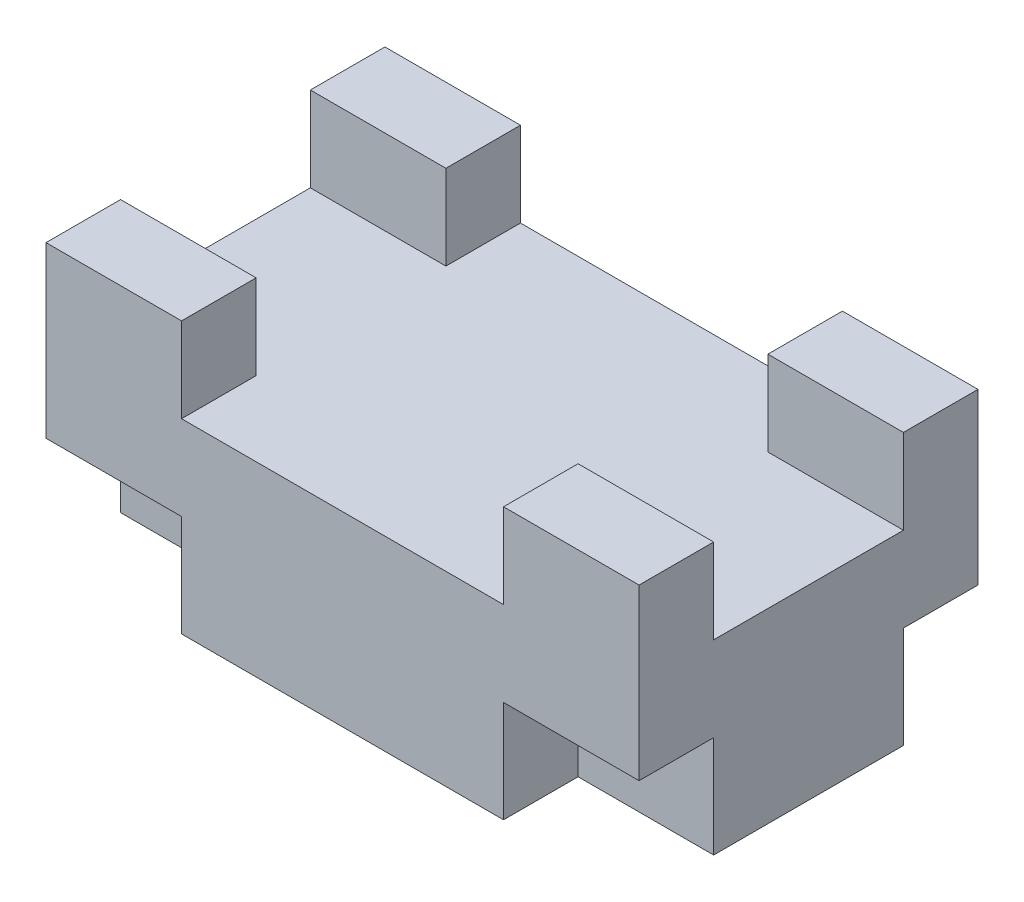
ISO-10303-21;
HEADER;
FILE_DESCRIPTION(('STEP AP214'),'2;1');
FILE_NAME('part.step','',(''),(''),'','','');
FILE_SCHEMA(('AUTOMOTIVE_DESIGN { 1 0 10303 214 1 1 1 1 }'));
ENDSEC;
DATA;
#1=APPLICATION_CONTEXT('core data for automotive mechanical design processes');
#2=APPLICATION_PROTOCOL_DEFINITION('international standard','automotive_design',2000,#1);
#3=PRODUCT_CONTEXT('',#1,'mechanical');
#4=PRODUCT('Part','Part','',(#3));
#5=PRODUCT_RELATED_PRODUCT_CATEGORY('part','',(#4));
#6=PRODUCT_DEFINITION_FORMATION('','',#4);
#7=PRODUCT_DEFINITION_CONTEXT('part definition',#1,'design');
#8=PRODUCT_DEFINITION('design','',#6,#7);
#9=PRODUCT_DEFINITION_SHAPE('','',#8);
#10=(LENGTH_UNIT() NAMED_UNIT(*) SI_UNIT(.MILLI.,.METRE.));
#11=(NAMED_UNIT(*) PLANE_ANGLE_UNIT() SI_UNIT($,.RADIAN.));
#12=(NAMED_UNIT(*) SI_UNIT($,.STERADIAN.) SOLID_ANGLE_UNIT());
#13=UNCERTAINTY_MEASURE_WITH_UNIT(LENGTH_MEASURE(1.E-05),#10,'distance_accuracy_value','');
#14=(GEOMETRIC_REPRESENTATION_CONTEXT(3) GLOBAL_UNCERTAINTY_ASSIGNED_CONTEXT((#13)) GLOBAL_UNIT_ASSIGNED_CONTEXT((#10,
#11,#12)) REPRESENTATION_CONTEXT('',''));
#15=CARTESIAN_POINT('',(0.,0.,0.));
#16=DIRECTION('',(0.,0.,1.));
#17=DIRECTION('',(1.,0.,0.));
#18=AXIS2_PLACEMENT_3D('',#15,#16,#17);
#19=CARTESIAN_POINT('',(87.5,-40.,50.));
#20=DIRECTION('',(0.,1.,0.));
#21=DIRECTION('',(-1.,0.,0.));
#22=AXIS2_PLACEMENT_3D('',#19,#20,#21);
#23=PLANE('',#22);
#24=DIRECTION('',(0.,0.,1.));
#25=VECTOR('',#24,1.);
#26=CARTESIAN_POINT('',(-47.5,-40.,-50.));
#27=LINE('',#26,#25);
#28=CARTESIAN_POINT('',(-47.5,-40.,-50.));
#29=VERTEX_POINT('',#28);
#30=CARTESIAN_POINT('',(-47.5,-40.,-28.));
#31=VERTEX_POINT('',#30);
#32=EDGE_CURVE('E807',#29,#31,#27,.T.);
#33=ORIENTED_EDGE('',*,*,#32,.F.);
#34=DIRECTION('',(1.,0.,0.));
#35=VECTOR('',#34,1.);
#36=CARTESIAN_POINT('',(87.5,-40.,-50.));
#37=LINE('',#36,#35);
#38=CARTESIAN_POINT('',(47.5,-40.,-50.));
#39=VERTEX_POINT('',#38);
#40=EDGE_CURVE('E256',#29,#39,#37,.T.);
#41=ORIENTED_EDGE('',*,*,#40,.T.);
#42=DIRECTION('',(0.,0.,1.));
#43=VECTOR('',#42,1.);
#44=CARTESIAN_POINT('',(47.5,-40.,-50.));
#45=LINE('',#44,#43);
#46=CARTESIAN_POINT('',(47.5,-40.,-28.));
#47=VERTEX_POINT('',#46);
#48=EDGE_CURVE('E310',#39,#47,#45,.T.);
#49=ORIENTED_EDGE('',*,*,#48,.T.);
#50=DIRECTION('',(1.,0.,0.));
#51=VECTOR('',#50,1.);
#52=CARTESIAN_POINT('',(87.5,-40.,-28.));
#53=LINE('',#52,#51);
#54=CARTESIAN_POINT('',(87.5,-40.,-28.));
#55=VERTEX_POINT('',#54);
#56=EDGE_CURVE('E307',#47,#55,#53,.T.);
#57=ORIENTED_EDGE('',*,*,#56,.T.);
#58=DIRECTION('',(0.,0.,-1.));
#59=VECTOR('',#58,1.);
#60=CARTESIAN_POINT('',(87.5,-40.,50.));
#61=LINE('',#60,#59);
#62=CARTESIAN_POINT('',(87.5,-40.,28.));
#63=VERTEX_POINT('',#62);
#64=EDGE_CURVE('E53',#63,#55,#61,.T.);
#65=ORIENTED_EDGE('',*,*,#64,.F.);
#66=DIRECTION('',(1.,0.,0.));
#67=VECTOR('',#66,1.);
#68=CARTESIAN_POINT('',(87.5,-40.,28.));
#69=LINE('',#68,#67);
#70=CARTESIAN_POINT('',(47.5,-40.,28.));
#71=VERTEX_POINT('',#70);
#72=EDGE_CURVE('E303',#71,#63,#69,.T.);
#73=ORIENTED_EDGE('',*,*,#72,.F.);
#74=DIRECTION('',(0.,0.,-1.));
#75=VECTOR('',#74,1.);
#76=CARTESIAN_POINT('',(47.5,-40.,50.));
#77=LINE('',#76,#75);
#78=CARTESIAN_POINT('',(47.5,-40.,50.));
#79=VERTEX_POINT('',#78);
#80=EDGE_CURVE('E329',#79,#71,#77,.T.);
#81=ORIENTED_EDGE('',*,*,#80,.F.);
#82=DIRECTION('',(1.,0.,0.));
#83=VECTOR('',#82,1.);
#84=CARTESIAN_POINT('',(87.5,-40.,50.));
#85=LINE('',#84,#83);
#86=CARTESIAN_POINT('',(-47.5,-40.,50.));
#87=VERTEX_POINT('',#86);
#88=EDGE_CURVE('E480',#87,#79,#85,.T.);
#89=ORIENTED_EDGE('',*,*,#88,.F.);
#90=DIRECTION('',(0.,0.,-1.));
#91=VECTOR('',#90,1.);
#92=CARTESIAN_POINT('',(-47.5,-40.,50.));
#93=LINE('',#92,#91);
#94=CARTESIAN_POINT('',(-47.5,-40.,28.));
#95=VERTEX_POINT('',#94);
#96=EDGE_CURVE('E534',#87,#95,#93,.T.);
#97=ORIENTED_EDGE('',*,*,#96,.T.);
#98=DIRECTION('',(-1.,0.,0.));
#99=VECTOR('',#98,1.);
#100=CARTESIAN_POINT('',(-87.5,-40.,28.));
#101=LINE('',#100,#99);
#102=CARTESIAN_POINT('',(-87.5,-40.,28.));
#103=VERTEX_POINT('',#102);
#104=EDGE_CURVE('E536',#95,#103,#101,.T.);
#105=ORIENTED_EDGE('',*,*,#104,.T.);
#106=DIRECTION('',(0.,0.,-1.));
#107=VECTOR('',#106,1.);
#108=CARTESIAN_POINT('',(-87.5,-40.,50.));
#109=LINE('',#108,#107);
#110=CARTESIAN_POINT('',(-87.5,-40.,-28.));
#111=VERTEX_POINT('',#110);
#112=EDGE_CURVE('E11',#103,#111,#109,.T.);
#113=ORIENTED_EDGE('',*,*,#112,.T.);
#114=DIRECTION('',(-1.,0.,0.));
#115=VECTOR('',#114,1.);
#116=CARTESIAN_POINT('',(-87.5,-40.,-28.));
#117=LINE('',#116,#115);
#118=EDGE_CURVE('E238',#31,#111,#117,.T.);
#119=ORIENTED_EDGE('',*,*,#118,.F.);
#120=EDGE_LOOP('',(#33,#41,#49,#57,#65,#73,#81,#89,#97,#105,#113,#119));
#121=FACE_BOUND('',#120,.T.);
#122=ADVANCED_FACE('F44',(#121),#23,.F.);
#123=CARTESIAN_POINT('',(0.,0.,-50.));
#124=DIRECTION('',(0.,0.,1.));
#125=DIRECTION('',(1.,0.,0.));
#126=AXIS2_PLACEMENT_3D('',#123,#124,#125);
#127=PLANE('',#126);
#128=DIRECTION('',(1.,0.,0.));
#129=VECTOR('',#128,1.);
#130=CARTESIAN_POINT('',(-87.5,-9.99999999999996,-50.));
#131=LINE('',#130,#129);
#132=CARTESIAN_POINT('',(-87.5,-9.99999999999996,-50.));
#133=VERTEX_POINT('',#132);
#134=CARTESIAN_POINT('',(-47.5,-9.99999999999997,-50.));
#135=VERTEX_POINT('',#134);
#136=EDGE_CURVE('E64',#133,#135,#131,.T.);
#137=ORIENTED_EDGE('',*,*,#136,.F.);
#138=DIRECTION('',(0.,-1.,0.));
#139=VECTOR('',#138,1.);
#140=CARTESIAN_POINT('',(-87.5,-40.,-50.));
#141=LINE('',#140,#139);
#142=CARTESIAN_POINT('',(-87.5,40.,-50.));
#143=VERTEX_POINT('',#142);
#144=EDGE_CURVE('E247',#143,#133,#141,.T.);
#145=ORIENTED_EDGE('',*,*,#144,.F.);
#146=DIRECTION('',(-1.,0.,0.));
#147=VECTOR('',#146,1.);
#148=CARTESIAN_POINT('',(87.5,40.,-50.));
#149=LINE('',#148,#147);
#150=CARTESIAN_POINT('',(-47.5,40.,-50.));
#151=VERTEX_POINT('',#150);
#152=EDGE_CURVE('E272',#151,#143,#149,.T.);
#153=ORIENTED_EDGE('',*,*,#152,.F.);
#154=DIRECTION('',(0.,1.,0.));
#155=VECTOR('',#154,1.);
#156=CARTESIAN_POINT('',(-47.5,15.,-50.));
#157=LINE('',#156,#155);
#158=CARTESIAN_POINT('',(-47.5,15.,-50.));
#159=VERTEX_POINT('',#158);
#160=EDGE_CURVE('E259',#159,#151,#157,.T.);
#161=ORIENTED_EDGE('',*,*,#160,.F.);
#162=DIRECTION('',(-1.,0.,0.));
#163=VECTOR('',#162,1.);
#164=CARTESIAN_POINT('',(47.5,15.,-50.));
#165=LINE('',#164,#163);
#166=CARTESIAN_POINT('',(47.5,15.,-50.));
#167=VERTEX_POINT('',#166);
#168=EDGE_CURVE('E408',#167,#159,#165,.T.);
#169=ORIENTED_EDGE('',*,*,#168,.F.);
#170=DIRECTION('',(0.,1.,0.));
#171=VECTOR('',#170,1.);
#172=CARTESIAN_POINT('',(47.5,15.,-50.));
#173=LINE('',#172,#171);
#174=CARTESIAN_POINT('',(47.5,40.,-50.));
#175=VERTEX_POINT('',#174);
#176=EDGE_CURVE('E264',#167,#175,#173,.T.);
#177=ORIENTED_EDGE('',*,*,#176,.T.);
#178=CARTESIAN_POINT('',(87.5,40.,-50.));
#179=VERTEX_POINT('',#178);
#180=EDGE_CURVE('E273',#179,#175,#149,.T.);
#181=ORIENTED_EDGE('',*,*,#180,.F.);
#182=DIRECTION('',(0.,1.,0.));
#183=VECTOR('',#182,1.);
#184=CARTESIAN_POINT('',(87.5,-40.,-50.));
#185=LINE('',#184,#183);
#186=CARTESIAN_POINT('',(87.5,-9.99999999999996,-50.));
#187=VERTEX_POINT('',#186);
#188=EDGE_CURVE('E263',#187,#179,#185,.T.);
#189=ORIENTED_EDGE('',*,*,#188,.F.);
#190=DIRECTION('',(-1.,0.,0.));
#191=VECTOR('',#190,1.);
#192=CARTESIAN_POINT('',(87.5,-9.99999999999996,-50.));
#193=LINE('',#192,#191);
#194=CARTESIAN_POINT('',(47.5,-9.99999999999997,-50.));
#195=VERTEX_POINT('',#194);
#196=EDGE_CURVE('E323',#187,#195,#193,.T.);
#197=ORIENTED_EDGE('',*,*,#196,.T.);
#198=DIRECTION('',(0.,-1.,0.));
#199=VECTOR('',#198,1.);
#200=CARTESIAN_POINT('',(47.5,-9.99999999999997,-50.));
#201=LINE('',#200,#199);
#202=EDGE_CURVE('E326',#195,#39,#201,.T.);
#203=ORIENTED_EDGE('',*,*,#202,.T.);
#204=ORIENTED_EDGE('',*,*,#40,.F.);
#205=DIRECTION('',(0.,-1.,0.));
#206=VECTOR('',#205,1.);
#207=CARTESIAN_POINT('',(-47.5,-9.99999999999997,-50.));
#208=LINE('',#207,#206);
#209=EDGE_CURVE('E248',#135,#29,#208,.T.);
#210=ORIENTED_EDGE('',*,*,#209,.F.);
#211=EDGE_LOOP('',(#137,#145,#153,#161,#169,#177,#181,#189,#197,#203,#204,#210));
#212=FACE_BOUND('',#211,.T.);
#213=ADVANCED_FACE('F242',(#212),#127,.F.);
#214=CARTESIAN_POINT('',(0.,0.,50.));
#215=DIRECTION('',(0.,0.,1.));
#216=DIRECTION('',(1.,0.,0.));
#217=AXIS2_PLACEMENT_3D('',#214,#215,#216);
#218=PLANE('',#217);
#219=DIRECTION('',(1.,0.,0.));
#220=VECTOR('',#219,1.);
#221=CARTESIAN_POINT('',(-87.5,-9.99999999999996,50.));
#222=LINE('',#221,#220);
#223=CARTESIAN_POINT('',(-87.5,-9.99999999999996,50.));
#224=VERTEX_POINT('',#223);
#225=CARTESIAN_POINT('',(-47.5,-9.99999999999997,50.));
#226=VERTEX_POINT('',#225);
#227=EDGE_CURVE('E551',#224,#226,#222,.T.);
#228=ORIENTED_EDGE('',*,*,#227,.T.);
#229=DIRECTION('',(0.,-1.,0.));
#230=VECTOR('',#229,1.);
#231=CARTESIAN_POINT('',(-47.5,-9.99999999999997,50.));
#232=LINE('',#231,#230);
#233=EDGE_CURVE('E311',#226,#87,#232,.T.);
#234=ORIENTED_EDGE('',*,*,#233,.T.);
#235=ORIENTED_EDGE('',*,*,#88,.T.);
#236=DIRECTION('',(0.,-1.,0.));
#237=VECTOR('',#236,1.);
#238=CARTESIAN_POINT('',(47.5,-9.99999999999997,50.));
#239=LINE('',#238,#237);
#240=CARTESIAN_POINT('',(47.5,-9.99999999999997,50.));
#241=VERTEX_POINT('',#240);
#242=EDGE_CURVE('E348',#241,#79,#239,.T.);
#243=ORIENTED_EDGE('',*,*,#242,.F.);
#244=DIRECTION('',(-1.,0.,0.));
#245=VECTOR('',#244,1.);
#246=CARTESIAN_POINT('',(87.5,-9.99999999999996,50.));
#247=LINE('',#246,#245);
#248=CARTESIAN_POINT('',(87.5,-9.99999999999996,50.));
#249=VERTEX_POINT('',#248);
#250=EDGE_CURVE('E338',#249,#241,#247,.T.);
#251=ORIENTED_EDGE('',*,*,#250,.F.);
#252=DIRECTION('',(0.,1.,0.));
#253=VECTOR('',#252,1.);
#254=CARTESIAN_POINT('',(87.5,-40.,50.));
#255=LINE('',#254,#253);
#256=CARTESIAN_POINT('',(87.5,40.,50.));
#257=VERTEX_POINT('',#256);
#258=EDGE_CURVE('E479',#249,#257,#255,.T.);
#259=ORIENTED_EDGE('',*,*,#258,.T.);
#260=DIRECTION('',(-1.,0.,0.));
#261=VECTOR('',#260,1.);
#262=CARTESIAN_POINT('',(87.5,40.,50.));
#263=LINE('',#262,#261);
#264=CARTESIAN_POINT('',(47.5,40.,50.));
#265=VERTEX_POINT('',#264);
#266=EDGE_CURVE('E268',#257,#265,#263,.T.);
#267=ORIENTED_EDGE('',*,*,#266,.T.);
#268=DIRECTION('',(0.,1.,0.));
#269=VECTOR('',#268,1.);
#270=CARTESIAN_POINT('',(47.5,15.,50.));
#271=LINE('',#270,#269);
#272=CARTESIAN_POINT('',(47.5,15.,50.));
#273=VERTEX_POINT('',#272);
#274=EDGE_CURVE('E457',#273,#265,#271,.T.);
#275=ORIENTED_EDGE('',*,*,#274,.F.);
#276=DIRECTION('',(1.,0.,0.));
#277=VECTOR('',#276,1.);
#278=CARTESIAN_POINT('',(47.5,15.,50.));
#279=LINE('',#278,#277);
#280=CARTESIAN_POINT('',(-47.5,15.,50.));
#281=VERTEX_POINT('',#280);
#282=EDGE_CURVE('E387',#281,#273,#279,.T.);
#283=ORIENTED_EDGE('',*,*,#282,.F.);
#284=DIRECTION('',(0.,1.,0.));
#285=VECTOR('',#284,1.);
#286=CARTESIAN_POINT('',(-47.5,15.,50.));
#287=LINE('',#286,#285);
#288=CARTESIAN_POINT('',(-47.5,40.,50.));
#289=VERTEX_POINT('',#288);
#290=EDGE_CURVE('E459',#281,#289,#287,.T.);
#291=ORIENTED_EDGE('',*,*,#290,.T.);
#292=CARTESIAN_POINT('',(-87.5,40.,50.));
#293=VERTEX_POINT('',#292);
#294=EDGE_CURVE('E481',#289,#293,#263,.T.);
#295=ORIENTED_EDGE('',*,*,#294,.T.);
#296=DIRECTION('',(0.,-1.,0.));
#297=VECTOR('',#296,1.);
#298=CARTESIAN_POINT('',(-87.5,-40.,50.));
#299=LINE('',#298,#297);
#300=EDGE_CURVE('E279',#293,#224,#299,.T.);
#301=ORIENTED_EDGE('',*,*,#300,.T.);
#302=EDGE_LOOP('',(#228,#234,#235,#243,#251,#259,#267,#275,#283,#291,#295,#301));
#303=FACE_BOUND('',#302,.T.);
#304=ADVANCED_FACE('F526',(#303),#218,.T.);
#305=CARTESIAN_POINT('',(87.5,40.,50.));
#306=DIRECTION('',(0.,-1.,0.));
#307=DIRECTION('',(1.,0.,0.));
#308=AXIS2_PLACEMENT_3D('',#305,#306,#307);
#309=PLANE('',#308);
#310=DIRECTION('',(0.,0.,1.));
#311=VECTOR('',#310,1.);
#312=CARTESIAN_POINT('',(-47.5,40.,-28.));
#313=LINE('',#312,#311);
#314=CARTESIAN_POINT('',(-47.5,40.,-28.));
#315=VERTEX_POINT('',#314);
#316=EDGE_CURVE('E359',#151,#315,#313,.T.);
#317=ORIENTED_EDGE('',*,*,#316,.F.);
#318=ORIENTED_EDGE('',*,*,#152,.T.);
#319=DIRECTION('',(0.,0.,-1.));
#320=VECTOR('',#319,1.);
#321=CARTESIAN_POINT('',(-87.5,40.,50.));
#322=LINE('',#321,#320);
#323=CARTESIAN_POINT('',(-87.5,40.,-28.));
#324=VERTEX_POINT('',#323);
#325=EDGE_CURVE('E254',#324,#143,#322,.T.);
#326=ORIENTED_EDGE('',*,*,#325,.F.);
#327=DIRECTION('',(-1.,0.,0.));
#328=VECTOR('',#327,1.);
#329=CARTESIAN_POINT('',(-47.5,40.,-28.));
#330=LINE('',#329,#328);
#331=EDGE_CURVE('E417',#315,#324,#330,.T.);
#332=ORIENTED_EDGE('',*,*,#331,.F.);
#333=EDGE_LOOP('',(#317,#318,#326,#332));
#334=FACE_BOUND('',#333,.T.);
#335=ADVANCED_FACE('F587',(#334),#309,.F.);
#336=DIRECTION('',(1.,0.,0.));
#337=VECTOR('',#336,1.);
#338=CARTESIAN_POINT('',(-47.5,40.,28.));
#339=LINE('',#338,#337);
#340=CARTESIAN_POINT('',(-87.5,40.,28.));
#341=VERTEX_POINT('',#340);
#342=CARTESIAN_POINT('',(-47.5,40.,28.));
#343=VERTEX_POINT('',#342);
#344=EDGE_CURVE('E419',#341,#343,#339,.T.);
#345=ORIENTED_EDGE('',*,*,#344,.F.);
#346=EDGE_CURVE('E276',#293,#341,#322,.T.);
#347=ORIENTED_EDGE('',*,*,#346,.F.);
#348=ORIENTED_EDGE('',*,*,#294,.F.);
#349=DIRECTION('',(0.,0.,1.));
#350=VECTOR('',#349,1.);
#351=CARTESIAN_POINT('',(-47.5,40.,50.));
#352=LINE('',#351,#350);
#353=EDGE_CURVE('E424',#343,#289,#352,.T.);
#354=ORIENTED_EDGE('',*,*,#353,.F.);
#355=EDGE_LOOP('',(#345,#347,#348,#354));
#356=FACE_BOUND('',#355,.T.);
#357=ADVANCED_FACE('F595',(#356),#309,.F.);
#358=DIRECTION('',(0.,0.,-1.));
#359=VECTOR('',#358,1.);
#360=CARTESIAN_POINT('',(47.5,40.,50.));
#361=LINE('',#360,#359);
#362=CARTESIAN_POINT('',(47.5,40.,28.));
#363=VERTEX_POINT('',#362);
#364=EDGE_CURVE('E430',#265,#363,#361,.T.);
#365=ORIENTED_EDGE('',*,*,#364,.F.);
#366=ORIENTED_EDGE('',*,*,#266,.F.);
#367=DIRECTION('',(0.,0.,-1.));
#368=VECTOR('',#367,1.);
#369=CARTESIAN_POINT('',(87.5,40.,50.));
#370=LINE('',#369,#368);
#371=CARTESIAN_POINT('',(87.5,40.,28.));
#372=VERTEX_POINT('',#371);
#373=EDGE_CURVE('E283',#257,#372,#370,.T.);
#374=ORIENTED_EDGE('',*,*,#373,.T.);
#375=DIRECTION('',(1.,0.,0.));
#376=VECTOR('',#375,1.);
#377=CARTESIAN_POINT('',(87.5,40.,28.));
#378=LINE('',#377,#376);
#379=EDGE_CURVE('E431',#363,#372,#378,.T.);
#380=ORIENTED_EDGE('',*,*,#379,.F.);
#381=EDGE_LOOP('',(#365,#366,#374,#380));
#382=FACE_BOUND('',#381,.T.);
#383=ADVANCED_FACE('F522',(#382),#309,.F.);
#384=DIRECTION('',(-1.,0.,0.));
#385=VECTOR('',#384,1.);
#386=CARTESIAN_POINT('',(87.5,40.,-28.));
#387=LINE('',#386,#385);
#388=CARTESIAN_POINT('',(87.5,40.,-28.));
#389=VERTEX_POINT('',#388);
#390=CARTESIAN_POINT('',(47.5,40.,-28.));
#391=VERTEX_POINT('',#390);
#392=EDGE_CURVE('E432',#389,#391,#387,.T.);
#393=ORIENTED_EDGE('',*,*,#392,.F.);
#394=EDGE_CURVE('E285',#389,#179,#370,.T.);
#395=ORIENTED_EDGE('',*,*,#394,.T.);
#396=ORIENTED_EDGE('',*,*,#180,.T.);
#397=DIRECTION('',(0.,0.,-1.));
#398=VECTOR('',#397,1.);
#399=CARTESIAN_POINT('',(47.5,40.,-28.));
#400=LINE('',#399,#398);
#401=EDGE_CURVE('E367',#391,#175,#400,.T.);
#402=ORIENTED_EDGE('',*,*,#401,.F.);
#403=EDGE_LOOP('',(#393,#395,#396,#402));
#404=FACE_BOUND('',#403,.T.);
#405=ADVANCED_FACE('F498',(#404),#309,.F.);
#406=CARTESIAN_POINT('',(-87.5,-40.,50.));
#407=DIRECTION('',(1.,0.,0.));
#408=DIRECTION('',(0.,0.,-1.));
#409=AXIS2_PLACEMENT_3D('',#406,#407,#408);
#410=PLANE('',#409);
#411=DIRECTION('',(0.,0.,-1.));
#412=VECTOR('',#411,1.);
#413=CARTESIAN_POINT('',(-87.5,-9.99999999999996,-50.));
#414=LINE('',#413,#412);
#415=CARTESIAN_POINT('',(-87.5,-9.99999999999996,-28.));
#416=VERTEX_POINT('',#415);
#417=EDGE_CURVE('E232',#416,#133,#414,.T.);
#418=ORIENTED_EDGE('',*,*,#417,.F.);
#419=DIRECTION('',(0.,-1.,0.));
#420=VECTOR('',#419,1.);
#421=CARTESIAN_POINT('',(-87.5,-9.99999999999996,-28.));
#422=LINE('',#421,#420);
#423=EDGE_CURVE('E544',#416,#111,#422,.T.);
#424=ORIENTED_EDGE('',*,*,#423,.T.);
#425=ORIENTED_EDGE('',*,*,#112,.F.);
#426=DIRECTION('',(0.,-1.,0.));
#427=VECTOR('',#426,1.);
#428=CARTESIAN_POINT('',(-87.5,-9.99999999999996,28.));
#429=LINE('',#428,#427);
#430=CARTESIAN_POINT('',(-87.5,-9.99999999999996,28.));
#431=VERTEX_POINT('',#430);
#432=EDGE_CURVE('E552',#431,#103,#429,.T.);
#433=ORIENTED_EDGE('',*,*,#432,.F.);
#434=DIRECTION('',(0.,0.,1.));
#435=VECTOR('',#434,1.);
#436=CARTESIAN_POINT('',(-87.5,-9.99999999999996,50.));
#437=LINE('',#436,#435);
#438=EDGE_CURVE('E68',#431,#224,#437,.T.);
#439=ORIENTED_EDGE('',*,*,#438,.T.);
#440=ORIENTED_EDGE('',*,*,#300,.F.);
#441=ORIENTED_EDGE('',*,*,#346,.T.);
#442=DIRECTION('',(0.,1.,0.));
#443=VECTOR('',#442,1.);
#444=CARTESIAN_POINT('',(-87.5,15.,28.));
#445=LINE('',#444,#443);
#446=CARTESIAN_POINT('',(-87.5,15.,28.));
#447=VERTEX_POINT('',#446);
#448=EDGE_CURVE('E466',#447,#341,#445,.T.);
#449=ORIENTED_EDGE('',*,*,#448,.F.);
#450=DIRECTION('',(0.,0.,1.));
#451=VECTOR('',#450,1.);
#452=CARTESIAN_POINT('',(-87.5,15.,28.));
#453=LINE('',#452,#451);
#454=CARTESIAN_POINT('',(-87.5,15.,-28.));
#455=VERTEX_POINT('',#454);
#456=EDGE_CURVE('E372',#455,#447,#453,.T.);
#457=ORIENTED_EDGE('',*,*,#456,.F.);
#458=DIRECTION('',(0.,1.,0.));
#459=VECTOR('',#458,1.);
#460=CARTESIAN_POINT('',(-87.5,15.,-28.));
#461=LINE('',#460,#459);
#462=EDGE_CURVE('E468',#455,#324,#461,.T.);
#463=ORIENTED_EDGE('',*,*,#462,.T.);
#464=ORIENTED_EDGE('',*,*,#325,.T.);
#465=ORIENTED_EDGE('',*,*,#144,.T.);
#466=EDGE_LOOP('',(#418,#424,#425,#433,#439,#440,#441,#449,#457,#463,#464,#465));
#467=FACE_BOUND('',#466,.T.);
#468=ADVANCED_FACE('F50',(#467),#410,.F.);
#469=CARTESIAN_POINT('',(87.5,-40.,50.));
#470=DIRECTION('',(-1.,0.,0.));
#471=DIRECTION('',(0.,-1.,0.));
#472=AXIS2_PLACEMENT_3D('',#469,#470,#471);
#473=PLANE('',#472);
#474=DIRECTION('',(0.,-1.,0.));
#475=VECTOR('',#474,1.);
#476=CARTESIAN_POINT('',(87.5,-9.99999999999996,-28.));
#477=LINE('',#476,#475);
#478=CARTESIAN_POINT('',(87.5,-9.99999999999996,-28.));
#479=VERTEX_POINT('',#478);
#480=EDGE_CURVE('E293',#479,#55,#477,.T.);
#481=ORIENTED_EDGE('',*,*,#480,.F.);
#482=DIRECTION('',(0.,0.,-1.));
#483=VECTOR('',#482,1.);
#484=CARTESIAN_POINT('',(87.5,-9.99999999999996,-50.));
#485=LINE('',#484,#483);
#486=EDGE_CURVE('E320',#479,#187,#485,.T.);
#487=ORIENTED_EDGE('',*,*,#486,.T.);
#488=ORIENTED_EDGE('',*,*,#188,.T.);
#489=ORIENTED_EDGE('',*,*,#394,.F.);
#490=DIRECTION('',(0.,1.,0.));
#491=VECTOR('',#490,1.);
#492=CARTESIAN_POINT('',(87.5,15.,-28.));
#493=LINE('',#492,#491);
#494=CARTESIAN_POINT('',(87.5,15.,-28.));
#495=VERTEX_POINT('',#494);
#496=EDGE_CURVE('E449',#495,#389,#493,.T.);
#497=ORIENTED_EDGE('',*,*,#496,.F.);
#498=DIRECTION('',(0.,0.,-1.));
#499=VECTOR('',#498,1.);
#500=CARTESIAN_POINT('',(87.5,15.,28.));
#501=LINE('',#500,#499);
#502=CARTESIAN_POINT('',(87.5,15.,28.));
#503=VERTEX_POINT('',#502);
#504=EDGE_CURVE('E399',#503,#495,#501,.T.);
#505=ORIENTED_EDGE('',*,*,#504,.F.);
#506=DIRECTION('',(0.,1.,0.));
#507=VECTOR('',#506,1.);
#508=CARTESIAN_POINT('',(87.5,15.,28.));
#509=LINE('',#508,#507);
#510=EDGE_CURVE('E448',#503,#372,#509,.T.);
#511=ORIENTED_EDGE('',*,*,#510,.T.);
#512=ORIENTED_EDGE('',*,*,#373,.F.);
#513=ORIENTED_EDGE('',*,*,#258,.F.);
#514=DIRECTION('',(0.,0.,1.));
#515=VECTOR('',#514,1.);
#516=CARTESIAN_POINT('',(87.5,-9.99999999999996,50.));
#517=LINE('',#516,#515);
#518=CARTESIAN_POINT('',(87.5,-9.99999999999996,28.));
#519=VERTEX_POINT('',#518);
#520=EDGE_CURVE('E339',#519,#249,#517,.T.);
#521=ORIENTED_EDGE('',*,*,#520,.F.);
#522=DIRECTION('',(0.,-1.,0.));
#523=VECTOR('',#522,1.);
#524=CARTESIAN_POINT('',(87.5,-9.99999999999996,28.));
#525=LINE('',#524,#523);
#526=EDGE_CURVE('E300',#519,#63,#525,.T.);
#527=ORIENTED_EDGE('',*,*,#526,.T.);
#528=ORIENTED_EDGE('',*,*,#64,.T.);
#529=EDGE_LOOP('',(#481,#487,#488,#489,#497,#505,#511,#512,#513,#521,#527,#528));
#530=FACE_BOUND('',#529,.T.);
#531=ADVANCED_FACE('F291',(#530),#473,.F.);
#532=CARTESIAN_POINT('',(-47.5,15.,-28.));
#533=DIRECTION('',(-1.,0.,0.));
#534=DIRECTION('',(0.,-1.,0.));
#535=AXIS2_PLACEMENT_3D('',#532,#533,#534);
#536=PLANE('',#535);
#537=ORIENTED_EDGE('',*,*,#316,.T.);
#538=DIRECTION('',(0.,1.,0.));
#539=VECTOR('',#538,1.);
#540=CARTESIAN_POINT('',(-47.5,15.,-28.));
#541=LINE('',#540,#539);
#542=CARTESIAN_POINT('',(-47.5,15.,-28.));
#543=VERTEX_POINT('',#542);
#544=EDGE_CURVE('E414',#543,#315,#541,.T.);
#545=ORIENTED_EDGE('',*,*,#544,.F.);
#546=DIRECTION('',(0.,0.,1.));
#547=VECTOR('',#546,1.);
#548=CARTESIAN_POINT('',(-47.5,15.,-28.));
#549=LINE('',#548,#547);
#550=EDGE_CURVE('E364',#159,#543,#549,.T.);
#551=ORIENTED_EDGE('',*,*,#550,.F.);
#552=ORIENTED_EDGE('',*,*,#160,.T.);
#553=EDGE_LOOP('',(#537,#545,#551,#552));
#554=FACE_BOUND('',#553,.T.);
#555=ADVANCED_FACE('F589',(#554),#536,.F.);
#556=CARTESIAN_POINT('',(47.5,15.,-28.));
#557=DIRECTION('',(1.,0.,0.));
#558=DIRECTION('',(0.,0.,-1.));
#559=AXIS2_PLACEMENT_3D('',#556,#557,#558);
#560=PLANE('',#559);
#561=ORIENTED_EDGE('',*,*,#401,.T.);
#562=ORIENTED_EDGE('',*,*,#176,.F.);
#563=DIRECTION('',(0.,0.,-1.));
#564=VECTOR('',#563,1.);
#565=CARTESIAN_POINT('',(47.5,15.,-28.));
#566=LINE('',#565,#564);
#567=CARTESIAN_POINT('',(47.5,15.,-28.));
#568=VERTEX_POINT('',#567);
#569=EDGE_CURVE('E409',#568,#167,#566,.T.);
#570=ORIENTED_EDGE('',*,*,#569,.F.);
#571=DIRECTION('',(0.,1.,0.));
#572=VECTOR('',#571,1.);
#573=CARTESIAN_POINT('',(47.5,15.,-28.));
#574=LINE('',#573,#572);
#575=EDGE_CURVE('E444',#568,#391,#574,.T.);
#576=ORIENTED_EDGE('',*,*,#575,.T.);
#577=EDGE_LOOP('',(#561,#562,#570,#576));
#578=FACE_BOUND('',#577,.T.);
#579=ADVANCED_FACE('F510',(#578),#560,.F.);
#580=CARTESIAN_POINT('',(87.5,15.,-28.));
#581=DIRECTION('',(0.,0.,-1.));
#582=DIRECTION('',(-1.,0.,0.));
#583=AXIS2_PLACEMENT_3D('',#580,#581,#582);
#584=PLANE('',#583);
#585=ORIENTED_EDGE('',*,*,#392,.T.);
#586=ORIENTED_EDGE('',*,*,#575,.F.);
#587=DIRECTION('',(-1.,0.,0.));
#588=VECTOR('',#587,1.);
#589=CARTESIAN_POINT('',(87.5,15.,-28.));
#590=LINE('',#589,#588);
#591=EDGE_CURVE('E405',#495,#568,#590,.T.);
#592=ORIENTED_EDGE('',*,*,#591,.F.);
#593=ORIENTED_EDGE('',*,*,#496,.T.);
#594=EDGE_LOOP('',(#585,#586,#592,#593));
#595=FACE_BOUND('',#594,.T.);
#596=ADVANCED_FACE('F515',(#595),#584,.F.);
#597=CARTESIAN_POINT('',(87.5,15.,28.));
#598=DIRECTION('',(0.,0.,1.));
#599=DIRECTION('',(1.,0.,0.));
#600=AXIS2_PLACEMENT_3D('',#597,#598,#599);
#601=PLANE('',#600);
#602=ORIENTED_EDGE('',*,*,#379,.T.);
#603=ORIENTED_EDGE('',*,*,#510,.F.);
#604=DIRECTION('',(1.,0.,0.));
#605=VECTOR('',#604,1.);
#606=CARTESIAN_POINT('',(87.5,15.,28.));
#607=LINE('',#606,#605);
#608=CARTESIAN_POINT('',(47.5,15.,28.));
#609=VERTEX_POINT('',#608);
#610=EDGE_CURVE('E393',#609,#503,#607,.T.);
#611=ORIENTED_EDGE('',*,*,#610,.F.);
#612=DIRECTION('',(0.,1.,0.));
#613=VECTOR('',#612,1.);
#614=CARTESIAN_POINT('',(47.5,15.,28.));
#615=LINE('',#614,#613);
#616=EDGE_CURVE('E454',#609,#363,#615,.T.);
#617=ORIENTED_EDGE('',*,*,#616,.T.);
#618=EDGE_LOOP('',(#602,#603,#611,#617));
#619=FACE_BOUND('',#618,.T.);
#620=ADVANCED_FACE('F520',(#619),#601,.F.);
#621=CARTESIAN_POINT('',(47.5,15.,50.));
#622=DIRECTION('',(1.,0.,0.));
#623=DIRECTION('',(0.,0.,-1.));
#624=AXIS2_PLACEMENT_3D('',#621,#622,#623);
#625=PLANE('',#624);
#626=ORIENTED_EDGE('',*,*,#364,.T.);
#627=ORIENTED_EDGE('',*,*,#616,.F.);
#628=DIRECTION('',(0.,0.,-1.));
#629=VECTOR('',#628,1.);
#630=CARTESIAN_POINT('',(47.5,15.,50.));
#631=LINE('',#630,#629);
#632=EDGE_CURVE('E388',#273,#609,#631,.T.);
#633=ORIENTED_EDGE('',*,*,#632,.F.);
#634=ORIENTED_EDGE('',*,*,#274,.T.);
#635=EDGE_LOOP('',(#626,#627,#633,#634));
#636=FACE_BOUND('',#635,.T.);
#637=ADVANCED_FACE('F614',(#636),#625,.F.);
#638=CARTESIAN_POINT('',(-47.5,15.,50.));
#639=DIRECTION('',(-1.,0.,0.));
#640=DIRECTION('',(0.,-1.,0.));
#641=AXIS2_PLACEMENT_3D('',#638,#639,#640);
#642=PLANE('',#641);
#643=ORIENTED_EDGE('',*,*,#353,.T.);
#644=ORIENTED_EDGE('',*,*,#290,.F.);
#645=DIRECTION('',(0.,0.,1.));
#646=VECTOR('',#645,1.);
#647=CARTESIAN_POINT('',(-47.5,15.,50.));
#648=LINE('',#647,#646);
#649=CARTESIAN_POINT('',(-47.5,15.,28.));
#650=VERTEX_POINT('',#649);
#651=EDGE_CURVE('E385',#650,#281,#648,.T.);
#652=ORIENTED_EDGE('',*,*,#651,.F.);
#653=DIRECTION('',(0.,1.,0.));
#654=VECTOR('',#653,1.);
#655=CARTESIAN_POINT('',(-47.5,15.,28.));
#656=LINE('',#655,#654);
#657=EDGE_CURVE('E465',#650,#343,#656,.T.);
#658=ORIENTED_EDGE('',*,*,#657,.T.);
#659=EDGE_LOOP('',(#643,#644,#652,#658));
#660=FACE_BOUND('',#659,.T.);
#661=ADVANCED_FACE('F610',(#660),#642,.F.);
#662=CARTESIAN_POINT('',(-47.5,15.,28.));
#663=DIRECTION('',(0.,0.,1.));
#664=DIRECTION('',(1.,0.,0.));
#665=AXIS2_PLACEMENT_3D('',#662,#663,#664);
#666=PLANE('',#665);
#667=ORIENTED_EDGE('',*,*,#344,.T.);
#668=ORIENTED_EDGE('',*,*,#657,.F.);
#669=DIRECTION('',(1.,0.,0.));
#670=VECTOR('',#669,1.);
#671=CARTESIAN_POINT('',(-47.5,15.,28.));
#672=LINE('',#671,#670);
#673=EDGE_CURVE('E378',#447,#650,#672,.T.);
#674=ORIENTED_EDGE('',*,*,#673,.F.);
#675=ORIENTED_EDGE('',*,*,#448,.T.);
#676=EDGE_LOOP('',(#667,#668,#674,#675));
#677=FACE_BOUND('',#676,.T.);
#678=ADVANCED_FACE('F602',(#677),#666,.F.);
#679=CARTESIAN_POINT('',(-47.5,15.,-28.));
#680=DIRECTION('',(0.,0.,-1.));
#681=DIRECTION('',(-1.,0.,0.));
#682=AXIS2_PLACEMENT_3D('',#679,#680,#681);
#683=PLANE('',#682);
#684=ORIENTED_EDGE('',*,*,#331,.T.);
#685=ORIENTED_EDGE('',*,*,#462,.F.);
#686=DIRECTION('',(-1.,0.,0.));
#687=VECTOR('',#686,1.);
#688=CARTESIAN_POINT('',(-47.5,15.,-28.));
#689=LINE('',#688,#687);
#690=EDGE_CURVE('E369',#543,#455,#689,.T.);
#691=ORIENTED_EDGE('',*,*,#690,.F.);
#692=ORIENTED_EDGE('',*,*,#544,.T.);
#693=EDGE_LOOP('',(#684,#685,#691,#692));
#694=FACE_BOUND('',#693,.T.);
#695=ADVANCED_FACE('F599',(#694),#683,.F.);
#696=CARTESIAN_POINT('',(0.,15.,0.));
#697=DIRECTION('',(0.,1.,0.));
#698=DIRECTION('',(-1.,0.,0.));
#699=AXIS2_PLACEMENT_3D('',#696,#697,#698);
#700=PLANE('',#699);
#701=ORIENTED_EDGE('',*,*,#550,.T.);
#702=ORIENTED_EDGE('',*,*,#690,.T.);
#703=ORIENTED_EDGE('',*,*,#456,.T.);
#704=ORIENTED_EDGE('',*,*,#673,.T.);
#705=ORIENTED_EDGE('',*,*,#651,.T.);
#706=ORIENTED_EDGE('',*,*,#282,.T.);
#707=ORIENTED_EDGE('',*,*,#632,.T.);
#708=ORIENTED_EDGE('',*,*,#610,.T.);
#709=ORIENTED_EDGE('',*,*,#504,.T.);
#710=ORIENTED_EDGE('',*,*,#591,.T.);
#711=ORIENTED_EDGE('',*,*,#569,.T.);
#712=ORIENTED_EDGE('',*,*,#168,.T.);
#713=EDGE_LOOP('',(#701,#702,#703,#704,#705,#706,#707,#708,#709,#710,#711,#712));
#714=FACE_BOUND('',#713,.T.);
#715=ADVANCED_FACE('F513',(#714),#700,.T.);
#716=CARTESIAN_POINT('',(87.5,-9.99999999999996,28.));
#717=DIRECTION('',(0.,0.,-1.));
#718=DIRECTION('',(-1.,0.,0.));
#719=AXIS2_PLACEMENT_3D('',#716,#717,#718);
#720=PLANE('',#719);
#721=ORIENTED_EDGE('',*,*,#72,.T.);
#722=ORIENTED_EDGE('',*,*,#526,.F.);
#723=DIRECTION('',(1.,0.,0.));
#724=VECTOR('',#723,1.);
#725=CARTESIAN_POINT('',(87.5,-9.99999999999996,28.));
#726=LINE('',#725,#724);
#727=CARTESIAN_POINT('',(47.5,-9.99999999999997,28.));
#728=VERTEX_POINT('',#727);
#729=EDGE_CURVE('E350',#728,#519,#726,.T.);
#730=ORIENTED_EDGE('',*,*,#729,.F.);
#731=DIRECTION('',(0.,-1.,0.));
#732=VECTOR('',#731,1.);
#733=CARTESIAN_POINT('',(47.5,-9.99999999999997,28.));
#734=LINE('',#733,#732);
#735=EDGE_CURVE('E358',#728,#71,#734,.T.);
#736=ORIENTED_EDGE('',*,*,#735,.T.);
#737=EDGE_LOOP('',(#721,#722,#730,#736));
#738=FACE_BOUND('',#737,.T.);
#739=ADVANCED_FACE('F624',(#738),#720,.F.);
#740=CARTESIAN_POINT('',(47.5,-9.99999999999997,50.));
#741=DIRECTION('',(-1.,0.,0.));
#742=DIRECTION('',(0.,0.,1.));
#743=AXIS2_PLACEMENT_3D('',#740,#741,#742);
#744=PLANE('',#743);
#745=ORIENTED_EDGE('',*,*,#80,.T.);
#746=ORIENTED_EDGE('',*,*,#735,.F.);
#747=DIRECTION('',(0.,0.,-1.));
#748=VECTOR('',#747,1.);
#749=CARTESIAN_POINT('',(47.5,-9.99999999999997,50.));
#750=LINE('',#749,#748);
#751=EDGE_CURVE('E344',#241,#728,#750,.T.);
#752=ORIENTED_EDGE('',*,*,#751,.F.);
#753=ORIENTED_EDGE('',*,*,#242,.T.);
#754=EDGE_LOOP('',(#745,#746,#752,#753));
#755=FACE_BOUND('',#754,.T.);
#756=ADVANCED_FACE('F533',(#755),#744,.F.);
#757=CARTESIAN_POINT('',(0.,-9.99999999999997,0.));
#758=DIRECTION('',(0.,1.,0.));
#759=DIRECTION('',(-1.,0.,0.));
#760=AXIS2_PLACEMENT_3D('',#757,#758,#759);
#761=PLANE('',#760);
#762=ORIENTED_EDGE('',*,*,#520,.T.);
#763=ORIENTED_EDGE('',*,*,#250,.T.);
#764=ORIENTED_EDGE('',*,*,#751,.T.);
#765=ORIENTED_EDGE('',*,*,#729,.T.);
#766=EDGE_LOOP('',(#762,#763,#764,#765));
#767=FACE_BOUND('',#766,.T.);
#768=ADVANCED_FACE('F523',(#767),#761,.F.);
#769=CARTESIAN_POINT('',(47.5,-9.99999999999997,-50.));
#770=DIRECTION('',(1.,0.,0.));
#771=DIRECTION('',(0.,0.,-1.));
#772=AXIS2_PLACEMENT_3D('',#769,#770,#771);
#773=PLANE('',#772);
#774=ORIENTED_EDGE('',*,*,#48,.F.);
#775=ORIENTED_EDGE('',*,*,#202,.F.);
#776=DIRECTION('',(0.,0.,1.));
#777=VECTOR('',#776,1.);
#778=CARTESIAN_POINT('',(47.5,-9.99999999999997,-50.));
#779=LINE('',#778,#777);
#780=CARTESIAN_POINT('',(47.5,-9.99999999999997,-28.));
#781=VERTEX_POINT('',#780);
#782=EDGE_CURVE('E558',#195,#781,#779,.T.);
#783=ORIENTED_EDGE('',*,*,#782,.T.);
#784=DIRECTION('',(0.,-1.,0.));
#785=VECTOR('',#784,1.);
#786=CARTESIAN_POINT('',(47.5,-9.99999999999997,-28.));
#787=LINE('',#786,#785);
#788=EDGE_CURVE('E332',#781,#47,#787,.T.);
#789=ORIENTED_EDGE('',*,*,#788,.T.);
#790=EDGE_LOOP('',(#774,#775,#783,#789));
#791=FACE_BOUND('',#790,.T.);
#792=ADVANCED_FACE('F566',(#791),#773,.T.);
#793=CARTESIAN_POINT('',(87.5,-9.99999999999996,-28.));
#794=DIRECTION('',(0.,0.,-1.));
#795=DIRECTION('',(-1.,0.,0.));
#796=AXIS2_PLACEMENT_3D('',#793,#794,#795);
#797=PLANE('',#796);
#798=ORIENTED_EDGE('',*,*,#56,.F.);
#799=ORIENTED_EDGE('',*,*,#788,.F.);
#800=DIRECTION('',(1.,0.,0.));
#801=VECTOR('',#800,1.);
#802=CARTESIAN_POINT('',(87.5,-9.99999999999996,-28.));
#803=LINE('',#802,#801);
#804=EDGE_CURVE('E556',#781,#479,#803,.T.);
#805=ORIENTED_EDGE('',*,*,#804,.T.);
#806=ORIENTED_EDGE('',*,*,#480,.T.);
#807=EDGE_LOOP('',(#798,#799,#805,#806));
#808=FACE_BOUND('',#807,.T.);
#809=ADVANCED_FACE('F569',(#808),#797,.T.);
#810=CARTESIAN_POINT('',(0.,-9.99999999999997,0.));
#811=DIRECTION('',(0.,1.,0.));
#812=DIRECTION('',(-1.,0.,0.));
#813=AXIS2_PLACEMENT_3D('',#810,#811,#812);
#814=PLANE('',#813);
#815=ORIENTED_EDGE('',*,*,#486,.F.);
#816=ORIENTED_EDGE('',*,*,#804,.F.);
#817=ORIENTED_EDGE('',*,*,#782,.F.);
#818=ORIENTED_EDGE('',*,*,#196,.F.);
#819=EDGE_LOOP('',(#815,#816,#817,#818));
#820=FACE_BOUND('',#819,.T.);
#821=ADVANCED_FACE('F567',(#820),#814,.F.);
#822=CARTESIAN_POINT('',(-47.5,-9.99999999999997,50.));
#823=DIRECTION('',(-1.,0.,0.));
#824=DIRECTION('',(0.,0.,1.));
#825=AXIS2_PLACEMENT_3D('',#822,#823,#824);
#826=PLANE('',#825);
#827=ORIENTED_EDGE('',*,*,#96,.F.);
#828=ORIENTED_EDGE('',*,*,#233,.F.);
#829=DIRECTION('',(0.,0.,-1.));
#830=VECTOR('',#829,1.);
#831=CARTESIAN_POINT('',(-47.5,-9.99999999999997,50.));
#832=LINE('',#831,#830);
#833=CARTESIAN_POINT('',(-47.5,-9.99999999999997,28.));
#834=VERTEX_POINT('',#833);
#835=EDGE_CURVE('E830',#226,#834,#832,.T.);
#836=ORIENTED_EDGE('',*,*,#835,.T.);
#837=DIRECTION('',(0.,-1.,0.));
#838=VECTOR('',#837,1.);
#839=CARTESIAN_POINT('',(-47.5,-9.99999999999997,28.));
#840=LINE('',#839,#838);
#841=EDGE_CURVE('E319',#834,#95,#840,.T.);
#842=ORIENTED_EDGE('',*,*,#841,.T.);
#843=EDGE_LOOP('',(#827,#828,#836,#842));
#844=FACE_BOUND('',#843,.T.);
#845=ADVANCED_FACE('F576',(#844),#826,.T.);
#846=CARTESIAN_POINT('',(-87.5,-9.99999999999996,28.));
#847=DIRECTION('',(0.,0.,1.));
#848=DIRECTION('',(1.,0.,0.));
#849=AXIS2_PLACEMENT_3D('',#846,#847,#848);
#850=PLANE('',#849);
#851=ORIENTED_EDGE('',*,*,#104,.F.);
#852=ORIENTED_EDGE('',*,*,#841,.F.);
#853=DIRECTION('',(-1.,0.,0.));
#854=VECTOR('',#853,1.);
#855=CARTESIAN_POINT('',(-87.5,-9.99999999999996,28.));
#856=LINE('',#855,#854);
#857=EDGE_CURVE('E543',#834,#431,#856,.T.);
#858=ORIENTED_EDGE('',*,*,#857,.T.);
#859=ORIENTED_EDGE('',*,*,#432,.T.);
#860=EDGE_LOOP('',(#851,#852,#858,#859));
#861=FACE_BOUND('',#860,.T.);
#862=ADVANCED_FACE('F758',(#861),#850,.T.);
#863=CARTESIAN_POINT('',(0.,-9.99999999999997,0.));
#864=DIRECTION('',(0.,1.,0.));
#865=DIRECTION('',(1.,0.,0.));
#866=AXIS2_PLACEMENT_3D('',#863,#864,#865);
#867=PLANE('',#866);
#868=ORIENTED_EDGE('',*,*,#438,.F.);
#869=ORIENTED_EDGE('',*,*,#857,.F.);
#870=ORIENTED_EDGE('',*,*,#835,.F.);
#871=ORIENTED_EDGE('',*,*,#227,.F.);
#872=EDGE_LOOP('',(#868,#869,#870,#871));
#873=FACE_BOUND('',#872,.T.);
#874=ADVANCED_FACE('F766',(#873),#867,.F.);
#875=CARTESIAN_POINT('',(-87.5,-9.99999999999996,-28.));
#876=DIRECTION('',(0.,0.,1.));
#877=DIRECTION('',(1.,0.,0.));
#878=AXIS2_PLACEMENT_3D('',#875,#876,#877);
#879=PLANE('',#878);
#880=ORIENTED_EDGE('',*,*,#118,.T.);
#881=ORIENTED_EDGE('',*,*,#423,.F.);
#882=DIRECTION('',(-1.,0.,0.));
#883=VECTOR('',#882,1.);
#884=CARTESIAN_POINT('',(-87.5,-9.99999999999996,-28.));
#885=LINE('',#884,#883);
#886=CARTESIAN_POINT('',(-47.5,-9.99999999999997,-28.));
#887=VERTEX_POINT('',#886);
#888=EDGE_CURVE('E235',#887,#416,#885,.T.);
#889=ORIENTED_EDGE('',*,*,#888,.F.);
#890=DIRECTION('',(0.,-1.,0.));
#891=VECTOR('',#890,1.);
#892=CARTESIAN_POINT('',(-47.5,-9.99999999999997,-28.));
#893=LINE('',#892,#891);
#894=EDGE_CURVE('E815',#887,#31,#893,.T.);
#895=ORIENTED_EDGE('',*,*,#894,.T.);
#896=EDGE_LOOP('',(#880,#881,#889,#895));
#897=FACE_BOUND('',#896,.T.);
#898=ADVANCED_FACE('F773',(#897),#879,.F.);
#899=CARTESIAN_POINT('',(-47.5,-9.99999999999997,-50.));
#900=DIRECTION('',(1.,0.,0.));
#901=DIRECTION('',(0.,0.,-1.));
#902=AXIS2_PLACEMENT_3D('',#899,#900,#901);
#903=PLANE('',#902);
#904=ORIENTED_EDGE('',*,*,#32,.T.);
#905=ORIENTED_EDGE('',*,*,#894,.F.);
#906=DIRECTION('',(0.,0.,1.));
#907=VECTOR('',#906,1.);
#908=CARTESIAN_POINT('',(-47.5,-9.99999999999997,-50.));
#909=LINE('',#908,#907);
#910=EDGE_CURVE('E253',#135,#887,#909,.T.);
#911=ORIENTED_EDGE('',*,*,#910,.F.);
#912=ORIENTED_EDGE('',*,*,#209,.T.);
#913=EDGE_LOOP('',(#904,#905,#911,#912));
#914=FACE_BOUND('',#913,.T.);
#915=ADVANCED_FACE('F784',(#914),#903,.F.);
#916=CARTESIAN_POINT('',(0.,-9.99999999999997,0.));
#917=DIRECTION('',(0.,1.,0.));
#918=DIRECTION('',(1.,0.,0.));
#919=AXIS2_PLACEMENT_3D('',#916,#917,#918);
#920=PLANE('',#919);
#921=ORIENTED_EDGE('',*,*,#417,.T.);
#922=ORIENTED_EDGE('',*,*,#136,.T.);
#923=ORIENTED_EDGE('',*,*,#910,.T.);
#924=ORIENTED_EDGE('',*,*,#888,.T.);
#925=EDGE_LOOP('',(#921,#922,#923,#924));
#926=FACE_BOUND('',#925,.T.);
#927=ADVANCED_FACE('F234',(#926),#920,.F.);
#928=CLOSED_SHELL('',(#122,#213,#304,#335,#357,#383,#405,#468,#531,#555,#579,#596,#620,#637,
#661,#678,#695,#715,#739,#756,#768,#792,#809,#821,#845,#862,#874,#898,#915,#927));
#929=MANIFOLD_SOLID_BREP('B2',#928);
#930=ADVANCED_BREP_SHAPE_REPRESENTATION('',(#18,#929),#14);
#931=SHAPE_DEFINITION_REPRESENTATION(#9,#930);
ENDSEC;
END-ISO-10303-21;
